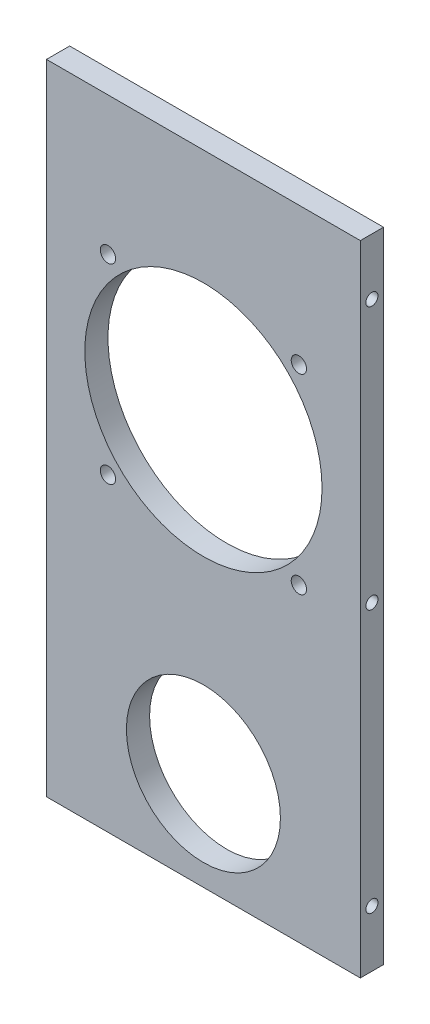
ISO-10303-21;
HEADER;
FILE_DESCRIPTION(('STEP AP214'),'2;1');
FILE_NAME('part.step','',(''),(''),'','','');
FILE_SCHEMA(('AUTOMOTIVE_DESIGN { 1 0 10303 214 1 1 1 1 }'));
ENDSEC;
DATA;
#1=APPLICATION_CONTEXT('core data for automotive mechanical design processes');
#2=APPLICATION_PROTOCOL_DEFINITION('international standard','automotive_design',2000,#1);
#3=PRODUCT_CONTEXT('',#1,'mechanical');
#4=PRODUCT('Part','Part','',(#3));
#5=PRODUCT_RELATED_PRODUCT_CATEGORY('part','',(#4));
#6=PRODUCT_DEFINITION_FORMATION('','',#4);
#7=PRODUCT_DEFINITION_CONTEXT('part definition',#1,'design');
#8=PRODUCT_DEFINITION('design','',#6,#7);
#9=PRODUCT_DEFINITION_SHAPE('','',#8);
#10=(LENGTH_UNIT() NAMED_UNIT(*) SI_UNIT(.MILLI.,.METRE.));
#11=(NAMED_UNIT(*) PLANE_ANGLE_UNIT() SI_UNIT($,.RADIAN.));
#12=(NAMED_UNIT(*) SI_UNIT($,.STERADIAN.) SOLID_ANGLE_UNIT());
#13=UNCERTAINTY_MEASURE_WITH_UNIT(LENGTH_MEASURE(1.E-05),#10,'distance_accuracy_value','');
#14=(GEOMETRIC_REPRESENTATION_CONTEXT(3) GLOBAL_UNCERTAINTY_ASSIGNED_CONTEXT((#13)) GLOBAL_UNIT_ASSIGNED_CONTEXT((#10,
#11,#12)) REPRESENTATION_CONTEXT('',''));
#15=CARTESIAN_POINT('',(0.,0.,0.));
#16=DIRECTION('',(0.,0.,1.));
#17=DIRECTION('',(1.,0.,0.));
#18=AXIS2_PLACEMENT_3D('',#15,#16,#17);
#19=CARTESIAN_POINT('',(43.,-87.5,3.175));
#20=DIRECTION('',(-1.,0.,0.));
#21=DIRECTION('',(0.,-1.,0.));
#22=AXIS2_PLACEMENT_3D('',#19,#20,#21);
#23=PLANE('',#22);
#24=CARTESIAN_POINT('',(43.,-72.,0.));
#25=DIRECTION('',(-1.,0.,0.));
#26=DIRECTION('',(0.,-1.,0.));
#27=AXIS2_PLACEMENT_3D('',#24,#25,#26);
#28=CIRCLE('',#27,1.65);
#29=CARTESIAN_POINT('',(43.,-73.65,0.));
#30=VERTEX_POINT('',#29);
#31=EDGE_CURVE('E150',#30,#30,#28,.T.);
#32=ORIENTED_EDGE('',*,*,#31,.T.);
#33=EDGE_LOOP('',(#32));
#34=FACE_BOUND('',#33,.T.);
#35=CARTESIAN_POINT('',(43.,0.,0.));
#36=DIRECTION('',(-1.,0.,0.));
#37=DIRECTION('',(0.,-1.,0.));
#38=AXIS2_PLACEMENT_3D('',#35,#36,#37);
#39=CIRCLE('',#38,1.65);
#40=CARTESIAN_POINT('',(43.,-1.65,0.));
#41=VERTEX_POINT('',#40);
#42=EDGE_CURVE('E143',#41,#41,#39,.T.);
#43=ORIENTED_EDGE('',*,*,#42,.T.);
#44=EDGE_LOOP('',(#43));
#45=FACE_BOUND('',#44,.T.);
#46=CARTESIAN_POINT('',(43.,72.,0.));
#47=DIRECTION('',(-1.,0.,0.));
#48=DIRECTION('',(0.,-1.,0.));
#49=AXIS2_PLACEMENT_3D('',#46,#47,#48);
#50=CIRCLE('',#49,1.65);
#51=CARTESIAN_POINT('',(43.,70.35,0.));
#52=VERTEX_POINT('',#51);
#53=EDGE_CURVE('E134',#52,#52,#50,.T.);
#54=ORIENTED_EDGE('',*,*,#53,.T.);
#55=EDGE_LOOP('',(#54));
#56=FACE_BOUND('',#55,.T.);
#57=DIRECTION('',(0.,1.,0.));
#58=VECTOR('',#57,1.);
#59=CARTESIAN_POINT('',(43.,-87.5,-3.175));
#60=LINE('',#59,#58);
#61=CARTESIAN_POINT('',(43.,-87.5,-3.175));
#62=VERTEX_POINT('',#61);
#63=CARTESIAN_POINT('',(43.,87.5,-3.175));
#64=VERTEX_POINT('',#63);
#65=EDGE_CURVE('E105',#62,#64,#60,.T.);
#66=ORIENTED_EDGE('',*,*,#65,.T.);
#67=DIRECTION('',(0.,0.,-1.));
#68=VECTOR('',#67,1.);
#69=CARTESIAN_POINT('',(43.,87.5,3.175));
#70=LINE('',#69,#68);
#71=CARTESIAN_POINT('',(43.,87.5,3.175));
#72=VERTEX_POINT('',#71);
#73=EDGE_CURVE('E11',#72,#64,#70,.T.);
#74=ORIENTED_EDGE('',*,*,#73,.F.);
#75=DIRECTION('',(0.,1.,0.));
#76=VECTOR('',#75,1.);
#77=CARTESIAN_POINT('',(43.,-87.5,3.175));
#78=LINE('',#77,#76);
#79=CARTESIAN_POINT('',(43.,-87.5,3.175));
#80=VERTEX_POINT('',#79);
#81=EDGE_CURVE('E89',#80,#72,#78,.T.);
#82=ORIENTED_EDGE('',*,*,#81,.F.);
#83=DIRECTION('',(0.,0.,-1.));
#84=VECTOR('',#83,1.);
#85=CARTESIAN_POINT('',(43.,-87.5,3.175));
#86=LINE('',#85,#84);
#87=EDGE_CURVE('E98',#80,#62,#86,.T.);
#88=ORIENTED_EDGE('',*,*,#87,.T.);
#89=EDGE_LOOP('',(#66,#74,#82,#88));
#90=FACE_BOUND('',#89,.T.);
#91=ADVANCED_FACE('F39',(#34,#45,#56,#90),#23,.F.);
#92=CARTESIAN_POINT('',(-43.,87.5,3.175));
#93=DIRECTION('',(0.,-1.,0.));
#94=DIRECTION('',(1.,0.,0.));
#95=AXIS2_PLACEMENT_3D('',#92,#93,#94);
#96=PLANE('',#95);
#97=DIRECTION('',(-1.,0.,0.));
#98=VECTOR('',#97,1.);
#99=CARTESIAN_POINT('',(-43.,87.5,-3.175));
#100=LINE('',#99,#98);
#101=CARTESIAN_POINT('',(-43.,87.5,-3.175));
#102=VERTEX_POINT('',#101);
#103=EDGE_CURVE('E94',#64,#102,#100,.T.);
#104=ORIENTED_EDGE('',*,*,#103,.T.);
#105=DIRECTION('',(0.,0.,-1.));
#106=VECTOR('',#105,1.);
#107=CARTESIAN_POINT('',(-43.,87.5,3.175));
#108=LINE('',#107,#106);
#109=CARTESIAN_POINT('',(-43.,87.5,3.175));
#110=VERTEX_POINT('',#109);
#111=EDGE_CURVE('E50',#110,#102,#108,.T.);
#112=ORIENTED_EDGE('',*,*,#111,.F.);
#113=DIRECTION('',(-1.,0.,0.));
#114=VECTOR('',#113,1.);
#115=CARTESIAN_POINT('',(-43.,87.5,3.175));
#116=LINE('',#115,#114);
#117=EDGE_CURVE('E81',#72,#110,#116,.T.);
#118=ORIENTED_EDGE('',*,*,#117,.F.);
#119=ORIENTED_EDGE('',*,*,#73,.T.);
#120=EDGE_LOOP('',(#104,#112,#118,#119));
#121=FACE_BOUND('',#120,.T.);
#122=ADVANCED_FACE('F91',(#121),#96,.F.);
#123=CARTESIAN_POINT('',(-43.,-87.5,3.175));
#124=DIRECTION('',(1.,0.,0.));
#125=DIRECTION('',(0.,1.,0.));
#126=AXIS2_PLACEMENT_3D('',#123,#124,#125);
#127=PLANE('',#126);
#128=CARTESIAN_POINT('',(-43.,-72.,0.));
#129=DIRECTION('',(-1.,0.,0.));
#130=DIRECTION('',(0.,-1.,0.));
#131=AXIS2_PLACEMENT_3D('',#128,#129,#130);
#132=CIRCLE('',#131,1.65);
#133=CARTESIAN_POINT('',(-43.,-73.65,0.));
#134=VERTEX_POINT('',#133);
#135=EDGE_CURVE('E129',#134,#134,#132,.T.);
#136=ORIENTED_EDGE('',*,*,#135,.F.);
#137=EDGE_LOOP('',(#136));
#138=FACE_BOUND('',#137,.T.);
#139=CARTESIAN_POINT('',(-43.,0.,0.));
#140=DIRECTION('',(-1.,0.,0.));
#141=DIRECTION('',(0.,-1.,0.));
#142=AXIS2_PLACEMENT_3D('',#139,#140,#141);
#143=CIRCLE('',#142,1.65);
#144=CARTESIAN_POINT('',(-43.,-1.65,0.));
#145=VERTEX_POINT('',#144);
#146=EDGE_CURVE('E127',#145,#145,#143,.T.);
#147=ORIENTED_EDGE('',*,*,#146,.F.);
#148=EDGE_LOOP('',(#147));
#149=FACE_BOUND('',#148,.T.);
#150=CARTESIAN_POINT('',(-43.,72.,0.));
#151=DIRECTION('',(-1.,0.,0.));
#152=DIRECTION('',(0.,-1.,0.));
#153=AXIS2_PLACEMENT_3D('',#150,#151,#152);
#154=CIRCLE('',#153,1.65);
#155=CARTESIAN_POINT('',(-43.,70.35,0.));
#156=VERTEX_POINT('',#155);
#157=EDGE_CURVE('E119',#156,#156,#154,.T.);
#158=ORIENTED_EDGE('',*,*,#157,.F.);
#159=EDGE_LOOP('',(#158));
#160=FACE_BOUND('',#159,.T.);
#161=DIRECTION('',(0.,-1.,0.));
#162=VECTOR('',#161,1.);
#163=CARTESIAN_POINT('',(-43.,-87.5,-3.175));
#164=LINE('',#163,#162);
#165=CARTESIAN_POINT('',(-43.,-87.5,-3.175));
#166=VERTEX_POINT('',#165);
#167=EDGE_CURVE('E75',#102,#166,#164,.T.);
#168=ORIENTED_EDGE('',*,*,#167,.T.);
#169=DIRECTION('',(0.,0.,-1.));
#170=VECTOR('',#169,1.);
#171=CARTESIAN_POINT('',(-43.,-87.5,3.175));
#172=LINE('',#171,#170);
#173=CARTESIAN_POINT('',(-43.,-87.5,3.175));
#174=VERTEX_POINT('',#173);
#175=EDGE_CURVE('E92',#174,#166,#172,.T.);
#176=ORIENTED_EDGE('',*,*,#175,.F.);
#177=DIRECTION('',(0.,-1.,0.));
#178=VECTOR('',#177,1.);
#179=CARTESIAN_POINT('',(-43.,-87.5,3.175));
#180=LINE('',#179,#178);
#181=EDGE_CURVE('E86',#110,#174,#180,.T.);
#182=ORIENTED_EDGE('',*,*,#181,.F.);
#183=ORIENTED_EDGE('',*,*,#111,.T.);
#184=EDGE_LOOP('',(#168,#176,#182,#183));
#185=FACE_BOUND('',#184,.T.);
#186=ADVANCED_FACE('F96',(#138,#149,#160,#185),#127,.F.);
#187=CARTESIAN_POINT('',(-43.,-87.5,3.175));
#188=DIRECTION('',(0.,1.,0.));
#189=DIRECTION('',(0.,0.,1.));
#190=AXIS2_PLACEMENT_3D('',#187,#188,#189);
#191=PLANE('',#190);
#192=DIRECTION('',(1.,0.,0.));
#193=VECTOR('',#192,1.);
#194=CARTESIAN_POINT('',(-43.,-87.5,-3.175));
#195=LINE('',#194,#193);
#196=EDGE_CURVE('E78',#166,#62,#195,.T.);
#197=ORIENTED_EDGE('',*,*,#196,.T.);
#198=ORIENTED_EDGE('',*,*,#87,.F.);
#199=DIRECTION('',(1.,0.,0.));
#200=VECTOR('',#199,1.);
#201=CARTESIAN_POINT('',(-43.,-87.5,3.175));
#202=LINE('',#201,#200);
#203=EDGE_CURVE('E54',#174,#80,#202,.T.);
#204=ORIENTED_EDGE('',*,*,#203,.F.);
#205=ORIENTED_EDGE('',*,*,#175,.T.);
#206=EDGE_LOOP('',(#197,#198,#204,#205));
#207=FACE_BOUND('',#206,.T.);
#208=ADVANCED_FACE('F109',(#207),#191,.F.);
#209=CARTESIAN_POINT('',(0.,0.,3.175));
#210=DIRECTION('',(0.,0.,-1.));
#211=DIRECTION('',(-1.,0.,0.));
#212=AXIS2_PLACEMENT_3D('',#209,#210,#211);
#213=PLANE('',#212);
#214=CARTESIAN_POINT('',(0.,-60.5,3.175));
#215=DIRECTION('',(0.,0.,1.));
#216=DIRECTION('',(1.,0.,0.));
#217=AXIS2_PLACEMENT_3D('',#214,#215,#216);
#218=CIRCLE('',#217,21.1);
#219=CARTESIAN_POINT('',(21.1,-60.5,3.175));
#220=VERTEX_POINT('',#219);
#221=EDGE_CURVE('E185',#220,#220,#218,.T.);
#222=ORIENTED_EDGE('',*,*,#221,.F.);
#223=EDGE_LOOP('',(#222));
#224=FACE_BOUND('',#223,.T.);
#225=CARTESIAN_POINT('',(26.1629509039021,49.6629509039024,3.175));
#226=DIRECTION('',(0.,0.,1.));
#227=DIRECTION('',(1.,0.,0.));
#228=AXIS2_PLACEMENT_3D('',#225,#226,#227);
#229=CIRCLE('',#228,2.1);
#230=CARTESIAN_POINT('',(28.2629509039021,49.6629509039024,3.175));
#231=VERTEX_POINT('',#230);
#232=EDGE_CURVE('E170',#231,#231,#229,.T.);
#233=ORIENTED_EDGE('',*,*,#232,.F.);
#234=EDGE_LOOP('',(#233));
#235=FACE_BOUND('',#234,.T.);
#236=CARTESIAN_POINT('',(26.1629509039024,-2.66295090390212,3.175));
#237=DIRECTION('',(0.,0.,1.));
#238=DIRECTION('',(1.,0.,0.));
#239=AXIS2_PLACEMENT_3D('',#236,#237,#238);
#240=CIRCLE('',#239,2.09999999999999);
#241=CARTESIAN_POINT('',(28.2629509039024,-2.66295090390212,3.175));
#242=VERTEX_POINT('',#241);
#243=EDGE_CURVE('E174',#242,#242,#240,.T.);
#244=ORIENTED_EDGE('',*,*,#243,.F.);
#245=EDGE_LOOP('',(#244));
#246=FACE_BOUND('',#245,.T.);
#247=CARTESIAN_POINT('',(-26.1629509039021,-2.66295090390241,3.175));
#248=DIRECTION('',(0.,0.,1.));
#249=DIRECTION('',(1.,0.,0.));
#250=AXIS2_PLACEMENT_3D('',#247,#248,#249);
#251=CIRCLE('',#250,2.1);
#252=CARTESIAN_POINT('',(-24.0629509039021,-2.66295090390241,3.175));
#253=VERTEX_POINT('',#252);
#254=EDGE_CURVE('E161',#253,#253,#251,.T.);
#255=ORIENTED_EDGE('',*,*,#254,.F.);
#256=EDGE_LOOP('',(#255));
#257=FACE_BOUND('',#256,.T.);
#258=CARTESIAN_POINT('',(-26.1629509039024,49.6629509039021,3.175));
#259=DIRECTION('',(0.,0.,1.));
#260=DIRECTION('',(1.,0.,0.));
#261=AXIS2_PLACEMENT_3D('',#258,#259,#260);
#262=CIRCLE('',#261,2.09999999999999);
#263=CARTESIAN_POINT('',(-24.0629509039024,49.6629509039021,3.175));
#264=VERTEX_POINT('',#263);
#265=EDGE_CURVE('E158',#264,#264,#262,.T.);
#266=ORIENTED_EDGE('',*,*,#265,.F.);
#267=EDGE_LOOP('',(#266));
#268=FACE_BOUND('',#267,.T.);
#269=CARTESIAN_POINT('',(0.,23.5,3.175));
#270=DIRECTION('',(0.,0.,1.));
#271=DIRECTION('',(1.,0.,0.));
#272=AXIS2_PLACEMENT_3D('',#269,#270,#271);
#273=CIRCLE('',#272,32.5);
#274=CARTESIAN_POINT('',(32.5,23.5,3.175));
#275=VERTEX_POINT('',#274);
#276=EDGE_CURVE('E155',#275,#275,#273,.T.);
#277=ORIENTED_EDGE('',*,*,#276,.F.);
#278=EDGE_LOOP('',(#277));
#279=FACE_BOUND('',#278,.T.);
#280=ORIENTED_EDGE('',*,*,#81,.T.);
#281=ORIENTED_EDGE('',*,*,#117,.T.);
#282=ORIENTED_EDGE('',*,*,#181,.T.);
#283=ORIENTED_EDGE('',*,*,#203,.T.);
#284=EDGE_LOOP('',(#280,#281,#282,#283));
#285=FACE_BOUND('',#284,.T.);
#286=ADVANCED_FACE('F88',(#224,#235,#246,#257,#268,#279,#285),#213,.F.);
#287=CARTESIAN_POINT('',(0.,0.,-3.175));
#288=DIRECTION('',(0.,0.,-1.));
#289=DIRECTION('',(-1.,0.,0.));
#290=AXIS2_PLACEMENT_3D('',#287,#288,#289);
#291=PLANE('',#290);
#292=CARTESIAN_POINT('',(0.,-60.5,-3.175));
#293=DIRECTION('',(0.,0.,1.));
#294=DIRECTION('',(1.,0.,0.));
#295=AXIS2_PLACEMENT_3D('',#292,#293,#294);
#296=CIRCLE('',#295,21.1);
#297=CARTESIAN_POINT('',(21.1,-60.5,-3.175));
#298=VERTEX_POINT('',#297);
#299=EDGE_CURVE('E169',#298,#298,#296,.T.);
#300=ORIENTED_EDGE('',*,*,#299,.T.);
#301=EDGE_LOOP('',(#300));
#302=FACE_BOUND('',#301,.T.);
#303=CARTESIAN_POINT('',(26.1629509039021,49.6629509039024,-3.175));
#304=DIRECTION('',(0.,0.,1.));
#305=DIRECTION('',(1.,0.,0.));
#306=AXIS2_PLACEMENT_3D('',#303,#304,#305);
#307=CIRCLE('',#306,2.1);
#308=CARTESIAN_POINT('',(28.2629509039021,49.6629509039024,-3.175));
#309=VERTEX_POINT('',#308);
#310=EDGE_CURVE('E163',#309,#309,#307,.T.);
#311=ORIENTED_EDGE('',*,*,#310,.T.);
#312=EDGE_LOOP('',(#311));
#313=FACE_BOUND('',#312,.T.);
#314=CARTESIAN_POINT('',(26.1629509039024,-2.66295090390212,-3.175));
#315=DIRECTION('',(0.,0.,1.));
#316=DIRECTION('',(1.,0.,0.));
#317=AXIS2_PLACEMENT_3D('',#314,#315,#316);
#318=CIRCLE('',#317,2.09999999999999);
#319=CARTESIAN_POINT('',(28.2629509039024,-2.66295090390212,-3.175));
#320=VERTEX_POINT('',#319);
#321=EDGE_CURVE('E172',#320,#320,#318,.T.);
#322=ORIENTED_EDGE('',*,*,#321,.T.);
#323=EDGE_LOOP('',(#322));
#324=FACE_BOUND('',#323,.T.);
#325=CARTESIAN_POINT('',(-26.1629509039021,-2.66295090390241,-3.175));
#326=DIRECTION('',(0.,0.,1.));
#327=DIRECTION('',(1.,0.,0.));
#328=AXIS2_PLACEMENT_3D('',#325,#326,#327);
#329=CIRCLE('',#328,2.1);
#330=CARTESIAN_POINT('',(-24.0629509039021,-2.66295090390241,-3.175));
#331=VERTEX_POINT('',#330);
#332=EDGE_CURVE('E179',#331,#331,#329,.T.);
#333=ORIENTED_EDGE('',*,*,#332,.T.);
#334=EDGE_LOOP('',(#333));
#335=FACE_BOUND('',#334,.T.);
#336=CARTESIAN_POINT('',(-26.1629509039024,49.6629509039021,-3.175));
#337=DIRECTION('',(0.,0.,1.));
#338=DIRECTION('',(1.,0.,0.));
#339=AXIS2_PLACEMENT_3D('',#336,#337,#338);
#340=CIRCLE('',#339,2.09999999999999);
#341=CARTESIAN_POINT('',(-24.0629509039024,49.6629509039021,-3.175));
#342=VERTEX_POINT('',#341);
#343=EDGE_CURVE('E154',#342,#342,#340,.T.);
#344=ORIENTED_EDGE('',*,*,#343,.T.);
#345=EDGE_LOOP('',(#344));
#346=FACE_BOUND('',#345,.T.);
#347=CARTESIAN_POINT('',(0.,23.5,-3.175));
#348=DIRECTION('',(0.,0.,1.));
#349=DIRECTION('',(1.,0.,0.));
#350=AXIS2_PLACEMENT_3D('',#347,#348,#349);
#351=CIRCLE('',#350,32.5);
#352=CARTESIAN_POINT('',(32.5,23.5,-3.175));
#353=VERTEX_POINT('',#352);
#354=EDGE_CURVE('E137',#353,#353,#351,.T.);
#355=ORIENTED_EDGE('',*,*,#354,.T.);
#356=EDGE_LOOP('',(#355));
#357=FACE_BOUND('',#356,.T.);
#358=ORIENTED_EDGE('',*,*,#65,.F.);
#359=ORIENTED_EDGE('',*,*,#196,.F.);
#360=ORIENTED_EDGE('',*,*,#167,.F.);
#361=ORIENTED_EDGE('',*,*,#103,.F.);
#362=EDGE_LOOP('',(#358,#359,#360,#361));
#363=FACE_BOUND('',#362,.T.);
#364=ADVANCED_FACE('F114',(#302,#313,#324,#335,#346,#357,#363),#291,.T.);
#365=CARTESIAN_POINT('',(-33.,72.,0.));
#366=DIRECTION('',(-1.,0.,0.));
#367=DIRECTION('',(0.,-1.,0.));
#368=AXIS2_PLACEMENT_3D('',#365,#366,#367);
#369=CYLINDRICAL_SURFACE('',#368,1.65);
#370=CARTESIAN_POINT('',(-33.,72.,0.));
#371=DIRECTION('',(-1.,0.,0.));
#372=DIRECTION('',(0.,-1.,0.));
#373=AXIS2_PLACEMENT_3D('',#370,#371,#372);
#374=CIRCLE('',#373,1.65);
#375=CARTESIAN_POINT('',(-33.,70.35,0.));
#376=VERTEX_POINT('',#375);
#377=EDGE_CURVE('E117',#376,#376,#374,.T.);
#378=ORIENTED_EDGE('',*,*,#377,.F.);
#379=EDGE_LOOP('',(#378));
#380=FACE_BOUND('',#379,.T.);
#381=ORIENTED_EDGE('',*,*,#157,.T.);
#382=EDGE_LOOP('',(#381));
#383=FACE_BOUND('',#382,.T.);
#384=ADVANCED_FACE('F268',(#380,#383),#369,.F.);
#385=CARTESIAN_POINT('',(-33.,72.,0.));
#386=DIRECTION('',(-1.,0.,0.));
#387=DIRECTION('',(0.,-1.,0.));
#388=AXIS2_PLACEMENT_3D('',#385,#386,#387);
#389=PLANE('',#388);
#390=ORIENTED_EDGE('',*,*,#377,.T.);
#391=EDGE_LOOP('',(#390));
#392=FACE_BOUND('',#391,.T.);
#393=ADVANCED_FACE('F263',(#392),#389,.T.);
#394=CARTESIAN_POINT('',(-33.,0.,0.));
#395=DIRECTION('',(-1.,0.,0.));
#396=DIRECTION('',(0.,-1.,0.));
#397=AXIS2_PLACEMENT_3D('',#394,#395,#396);
#398=CYLINDRICAL_SURFACE('',#397,1.65);
#399=CARTESIAN_POINT('',(-33.,0.,0.));
#400=DIRECTION('',(-1.,0.,0.));
#401=DIRECTION('',(0.,-1.,0.));
#402=AXIS2_PLACEMENT_3D('',#399,#400,#401);
#403=CIRCLE('',#402,1.65);
#404=CARTESIAN_POINT('',(-33.,-1.65,0.));
#405=VERTEX_POINT('',#404);
#406=EDGE_CURVE('E122',#405,#405,#403,.T.);
#407=ORIENTED_EDGE('',*,*,#406,.F.);
#408=EDGE_LOOP('',(#407));
#409=FACE_BOUND('',#408,.T.);
#410=ORIENTED_EDGE('',*,*,#146,.T.);
#411=EDGE_LOOP('',(#410));
#412=FACE_BOUND('',#411,.T.);
#413=ADVANCED_FACE('F257',(#409,#412),#398,.F.);
#414=CARTESIAN_POINT('',(-33.,0.,0.));
#415=DIRECTION('',(-1.,0.,0.));
#416=DIRECTION('',(0.,-1.,0.));
#417=AXIS2_PLACEMENT_3D('',#414,#415,#416);
#418=PLANE('',#417);
#419=ORIENTED_EDGE('',*,*,#406,.T.);
#420=EDGE_LOOP('',(#419));
#421=FACE_BOUND('',#420,.T.);
#422=ADVANCED_FACE('F256',(#421),#418,.T.);
#423=CARTESIAN_POINT('',(-33.,-72.,0.));
#424=DIRECTION('',(-1.,0.,0.));
#425=DIRECTION('',(0.,-1.,0.));
#426=AXIS2_PLACEMENT_3D('',#423,#424,#425);
#427=CYLINDRICAL_SURFACE('',#426,1.65);
#428=CARTESIAN_POINT('',(-33.,-72.,0.));
#429=DIRECTION('',(-1.,0.,0.));
#430=DIRECTION('',(0.,-1.,0.));
#431=AXIS2_PLACEMENT_3D('',#428,#429,#430);
#432=CIRCLE('',#431,1.65);
#433=CARTESIAN_POINT('',(-33.,-73.65,0.));
#434=VERTEX_POINT('',#433);
#435=EDGE_CURVE('E104',#434,#434,#432,.T.);
#436=ORIENTED_EDGE('',*,*,#435,.F.);
#437=EDGE_LOOP('',(#436));
#438=FACE_BOUND('',#437,.T.);
#439=ORIENTED_EDGE('',*,*,#135,.T.);
#440=EDGE_LOOP('',(#439));
#441=FACE_BOUND('',#440,.T.);
#442=ADVANCED_FACE('F253',(#438,#441),#427,.F.);
#443=CARTESIAN_POINT('',(-33.,-72.,0.));
#444=DIRECTION('',(-1.,0.,0.));
#445=DIRECTION('',(0.,-1.,0.));
#446=AXIS2_PLACEMENT_3D('',#443,#444,#445);
#447=PLANE('',#446);
#448=ORIENTED_EDGE('',*,*,#435,.T.);
#449=EDGE_LOOP('',(#448));
#450=FACE_BOUND('',#449,.T.);
#451=ADVANCED_FACE('F245',(#450),#447,.T.);
#452=CARTESIAN_POINT('',(33.,72.,0.));
#453=DIRECTION('',(1.,0.,0.));
#454=DIRECTION('',(0.,1.,0.));
#455=AXIS2_PLACEMENT_3D('',#452,#453,#454);
#456=CYLINDRICAL_SURFACE('',#455,1.65);
#457=CARTESIAN_POINT('',(33.,72.,0.));
#458=DIRECTION('',(-1.,0.,0.));
#459=DIRECTION('',(0.,-1.,0.));
#460=AXIS2_PLACEMENT_3D('',#457,#458,#459);
#461=CIRCLE('',#460,1.65);
#462=CARTESIAN_POINT('',(33.,70.35,0.));
#463=VERTEX_POINT('',#462);
#464=EDGE_CURVE('E139',#463,#463,#461,.T.);
#465=ORIENTED_EDGE('',*,*,#464,.T.);
#466=EDGE_LOOP('',(#465));
#467=FACE_BOUND('',#466,.T.);
#468=ORIENTED_EDGE('',*,*,#53,.F.);
#469=EDGE_LOOP('',(#468));
#470=FACE_BOUND('',#469,.T.);
#471=ADVANCED_FACE('F238',(#467,#470),#456,.F.);
#472=CARTESIAN_POINT('',(33.,72.,0.));
#473=DIRECTION('',(1.,0.,0.));
#474=DIRECTION('',(0.,-1.,0.));
#475=AXIS2_PLACEMENT_3D('',#472,#473,#474);
#476=PLANE('',#475);
#477=ORIENTED_EDGE('',*,*,#464,.F.);
#478=EDGE_LOOP('',(#477));
#479=FACE_BOUND('',#478,.T.);
#480=ADVANCED_FACE('F242',(#479),#476,.T.);
#481=CARTESIAN_POINT('',(33.,0.,0.));
#482=DIRECTION('',(1.,0.,0.));
#483=DIRECTION('',(0.,1.,0.));
#484=AXIS2_PLACEMENT_3D('',#481,#482,#483);
#485=CYLINDRICAL_SURFACE('',#484,1.65);
#486=CARTESIAN_POINT('',(33.,0.,0.));
#487=DIRECTION('',(-1.,0.,0.));
#488=DIRECTION('',(0.,-1.,0.));
#489=AXIS2_PLACEMENT_3D('',#486,#487,#488);
#490=CIRCLE('',#489,1.65);
#491=CARTESIAN_POINT('',(33.,-1.65,0.));
#492=VERTEX_POINT('',#491);
#493=EDGE_CURVE('E145',#492,#492,#490,.T.);
#494=ORIENTED_EDGE('',*,*,#493,.T.);
#495=EDGE_LOOP('',(#494));
#496=FACE_BOUND('',#495,.T.);
#497=ORIENTED_EDGE('',*,*,#42,.F.);
#498=EDGE_LOOP('',(#497));
#499=FACE_BOUND('',#498,.T.);
#500=ADVANCED_FACE('F247',(#496,#499),#485,.F.);
#501=CARTESIAN_POINT('',(33.,0.,0.));
#502=DIRECTION('',(1.,0.,0.));
#503=DIRECTION('',(0.,-1.,0.));
#504=AXIS2_PLACEMENT_3D('',#501,#502,#503);
#505=PLANE('',#504);
#506=ORIENTED_EDGE('',*,*,#493,.F.);
#507=EDGE_LOOP('',(#506));
#508=FACE_BOUND('',#507,.T.);
#509=ADVANCED_FACE('F341',(#508),#505,.T.);
#510=CARTESIAN_POINT('',(33.,-72.,0.));
#511=DIRECTION('',(1.,0.,0.));
#512=DIRECTION('',(0.,1.,0.));
#513=AXIS2_PLACEMENT_3D('',#510,#511,#512);
#514=CYLINDRICAL_SURFACE('',#513,1.65);
#515=CARTESIAN_POINT('',(33.,-72.,0.));
#516=DIRECTION('',(-1.,0.,0.));
#517=DIRECTION('',(0.,-1.,0.));
#518=AXIS2_PLACEMENT_3D('',#515,#516,#517);
#519=CIRCLE('',#518,1.65);
#520=CARTESIAN_POINT('',(33.,-73.65,0.));
#521=VERTEX_POINT('',#520);
#522=EDGE_CURVE('E116',#521,#521,#519,.T.);
#523=ORIENTED_EDGE('',*,*,#522,.T.);
#524=EDGE_LOOP('',(#523));
#525=FACE_BOUND('',#524,.T.);
#526=ORIENTED_EDGE('',*,*,#31,.F.);
#527=EDGE_LOOP('',(#526));
#528=FACE_BOUND('',#527,.T.);
#529=ADVANCED_FACE('F224',(#525,#528),#514,.F.);
#530=CARTESIAN_POINT('',(33.,-72.,0.));
#531=DIRECTION('',(1.,0.,0.));
#532=DIRECTION('',(0.,-1.,0.));
#533=AXIS2_PLACEMENT_3D('',#530,#531,#532);
#534=PLANE('',#533);
#535=ORIENTED_EDGE('',*,*,#522,.F.);
#536=EDGE_LOOP('',(#535));
#537=FACE_BOUND('',#536,.T.);
#538=ADVANCED_FACE('F213',(#537),#534,.T.);
#539=CARTESIAN_POINT('',(0.,23.5,-3.175));
#540=DIRECTION('',(0.,0.,1.));
#541=DIRECTION('',(1.,0.,0.));
#542=AXIS2_PLACEMENT_3D('',#539,#540,#541);
#543=CYLINDRICAL_SURFACE('',#542,32.5);
#544=ORIENTED_EDGE('',*,*,#354,.F.);
#545=EDGE_LOOP('',(#544));
#546=FACE_BOUND('',#545,.T.);
#547=ORIENTED_EDGE('',*,*,#276,.T.);
#548=EDGE_LOOP('',(#547));
#549=FACE_BOUND('',#548,.T.);
#550=ADVANCED_FACE('F209',(#546,#549),#543,.F.);
#551=CARTESIAN_POINT('',(-26.1629509039024,49.6629509039021,-3.175));
#552=DIRECTION('',(0.,0.,1.));
#553=DIRECTION('',(1.,0.,0.));
#554=AXIS2_PLACEMENT_3D('',#551,#552,#553);
#555=CYLINDRICAL_SURFACE('',#554,2.09999999999999);
#556=ORIENTED_EDGE('',*,*,#343,.F.);
#557=EDGE_LOOP('',(#556));
#558=FACE_BOUND('',#557,.T.);
#559=ORIENTED_EDGE('',*,*,#265,.T.);
#560=EDGE_LOOP('',(#559));
#561=FACE_BOUND('',#560,.T.);
#562=ADVANCED_FACE('F215',(#558,#561),#555,.F.);
#563=CARTESIAN_POINT('',(-26.1629509039021,-2.66295090390241,-3.175));
#564=DIRECTION('',(0.,0.,1.));
#565=DIRECTION('',(1.,0.,0.));
#566=AXIS2_PLACEMENT_3D('',#563,#564,#565);
#567=CYLINDRICAL_SURFACE('',#566,2.1);
#568=ORIENTED_EDGE('',*,*,#332,.F.);
#569=EDGE_LOOP('',(#568));
#570=FACE_BOUND('',#569,.T.);
#571=ORIENTED_EDGE('',*,*,#254,.T.);
#572=EDGE_LOOP('',(#571));
#573=FACE_BOUND('',#572,.T.);
#574=ADVANCED_FACE('F219',(#570,#573),#567,.F.);
#575=CARTESIAN_POINT('',(26.1629509039024,-2.66295090390212,-3.175));
#576=DIRECTION('',(0.,0.,1.));
#577=DIRECTION('',(1.,0.,0.));
#578=AXIS2_PLACEMENT_3D('',#575,#576,#577);
#579=CYLINDRICAL_SURFACE('',#578,2.09999999999999);
#580=ORIENTED_EDGE('',*,*,#321,.F.);
#581=EDGE_LOOP('',(#580));
#582=FACE_BOUND('',#581,.T.);
#583=ORIENTED_EDGE('',*,*,#243,.T.);
#584=EDGE_LOOP('',(#583));
#585=FACE_BOUND('',#584,.T.);
#586=ADVANCED_FACE('F389',(#582,#585),#579,.F.);
#587=CARTESIAN_POINT('',(26.1629509039021,49.6629509039024,-3.175));
#588=DIRECTION('',(0.,0.,1.));
#589=DIRECTION('',(1.,0.,0.));
#590=AXIS2_PLACEMENT_3D('',#587,#588,#589);
#591=CYLINDRICAL_SURFACE('',#590,2.1);
#592=ORIENTED_EDGE('',*,*,#310,.F.);
#593=EDGE_LOOP('',(#592));
#594=FACE_BOUND('',#593,.T.);
#595=ORIENTED_EDGE('',*,*,#232,.T.);
#596=EDGE_LOOP('',(#595));
#597=FACE_BOUND('',#596,.T.);
#598=ADVANCED_FACE('F192',(#594,#597),#591,.F.);
#599=CARTESIAN_POINT('',(0.,-60.5,-3.175));
#600=DIRECTION('',(0.,0.,1.));
#601=DIRECTION('',(1.,0.,0.));
#602=AXIS2_PLACEMENT_3D('',#599,#600,#601);
#603=CYLINDRICAL_SURFACE('',#602,21.1);
#604=ORIENTED_EDGE('',*,*,#299,.F.);
#605=EDGE_LOOP('',(#604));
#606=FACE_BOUND('',#605,.T.);
#607=ORIENTED_EDGE('',*,*,#221,.T.);
#608=EDGE_LOOP('',(#607));
#609=FACE_BOUND('',#608,.T.);
#610=ADVANCED_FACE('F186',(#606,#609),#603,.F.);
#611=CLOSED_SHELL('',(#91,#122,#186,#208,#286,#364,#384,#393,#413,#422,#442,#451,#471,#480,#500,
#509,#529,#538,#550,#562,#574,#586,#598,#610));
#612=MANIFOLD_SOLID_BREP('B2',#611);
#613=ADVANCED_BREP_SHAPE_REPRESENTATION('',(#18,#612),#14);
#614=SHAPE_DEFINITION_REPRESENTATION(#9,#613);
ENDSEC;
END-ISO-10303-21;
